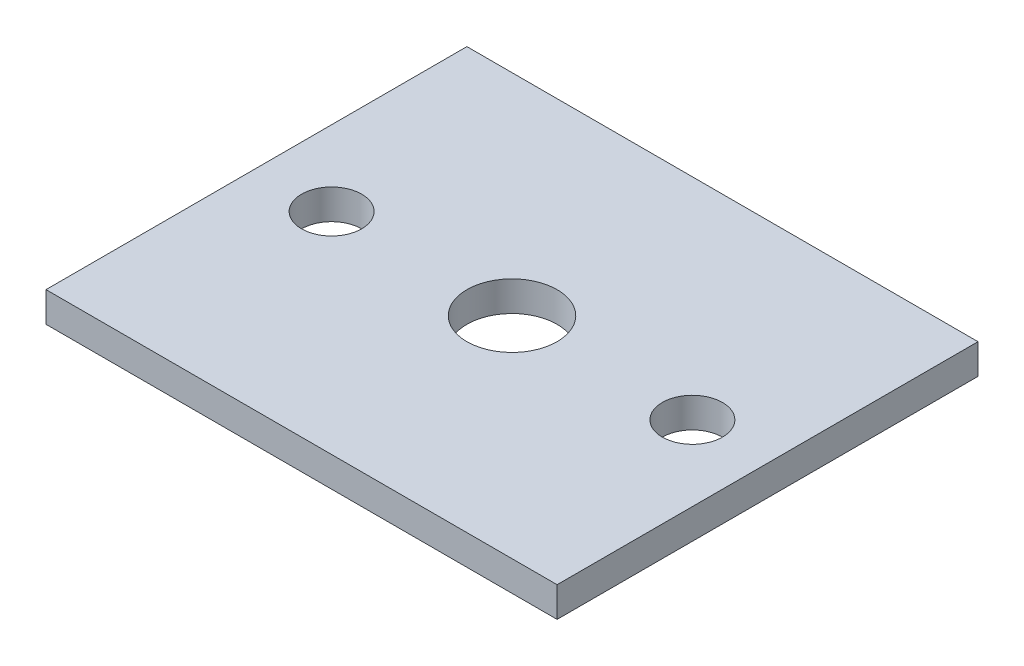
ISO-10303-21;
HEADER;
FILE_DESCRIPTION(('STEP AP214'),'2;1');
FILE_NAME('part.step','',(''),(''),'','','');
FILE_SCHEMA(('AUTOMOTIVE_DESIGN { 1 0 10303 214 1 1 1 1 }'));
ENDSEC;
DATA;
#1=APPLICATION_CONTEXT('core data for automotive mechanical design processes');
#2=APPLICATION_PROTOCOL_DEFINITION('international standard','automotive_design',2000,#1);
#3=PRODUCT_CONTEXT('',#1,'mechanical');
#4=PRODUCT('Part','Part','',(#3));
#5=PRODUCT_RELATED_PRODUCT_CATEGORY('part','',(#4));
#6=PRODUCT_DEFINITION_FORMATION('','',#4);
#7=PRODUCT_DEFINITION_CONTEXT('part definition',#1,'design');
#8=PRODUCT_DEFINITION('design','',#6,#7);
#9=PRODUCT_DEFINITION_SHAPE('','',#8);
#10=(LENGTH_UNIT() NAMED_UNIT(*) SI_UNIT(.MILLI.,.METRE.));
#11=(NAMED_UNIT(*) PLANE_ANGLE_UNIT() SI_UNIT($,.RADIAN.));
#12=(NAMED_UNIT(*) SI_UNIT($,.STERADIAN.) SOLID_ANGLE_UNIT());
#13=UNCERTAINTY_MEASURE_WITH_UNIT(LENGTH_MEASURE(1.E-05),#10,'distance_accuracy_value','');
#14=(GEOMETRIC_REPRESENTATION_CONTEXT(3) GLOBAL_UNCERTAINTY_ASSIGNED_CONTEXT((#13)) GLOBAL_UNIT_ASSIGNED_CONTEXT((#10,
#11,#12)) REPRESENTATION_CONTEXT('',''));
#15=CARTESIAN_POINT('',(0.,0.,0.));
#16=DIRECTION('',(0.,0.,1.));
#17=DIRECTION('',(1.,0.,0.));
#18=AXIS2_PLACEMENT_3D('',#15,#16,#17);
#19=CARTESIAN_POINT('',(0.,10.,0.));
#20=DIRECTION('',(1.,0.,0.));
#21=DIRECTION('',(0.,0.,-1.));
#22=AXIS2_PLACEMENT_3D('',#19,#20,#21);
#23=PLANE('',#22);
#24=DIRECTION('',(0.,0.,1.));
#25=VECTOR('',#24,1.);
#26=CARTESIAN_POINT('',(0.,0.,0.));
#27=LINE('',#26,#25);
#28=CARTESIAN_POINT('',(0.,0.,-140.));
#29=VERTEX_POINT('',#28);
#30=CARTESIAN_POINT('',(0.,0.,0.));
#31=VERTEX_POINT('',#30);
#32=EDGE_CURVE('E110',#29,#31,#27,.T.);
#33=ORIENTED_EDGE('',*,*,#32,.T.);
#34=DIRECTION('',(0.,-1.,0.));
#35=VECTOR('',#34,1.);
#36=CARTESIAN_POINT('',(0.,10.,0.));
#37=LINE('',#36,#35);
#38=CARTESIAN_POINT('',(0.,10.,0.));
#39=VERTEX_POINT('',#38);
#40=EDGE_CURVE('E11',#39,#31,#37,.T.);
#41=ORIENTED_EDGE('',*,*,#40,.F.);
#42=DIRECTION('',(0.,0.,1.));
#43=VECTOR('',#42,1.);
#44=CARTESIAN_POINT('',(0.,10.,0.));
#45=LINE('',#44,#43);
#46=CARTESIAN_POINT('',(0.,10.,-140.));
#47=VERTEX_POINT('',#46);
#48=EDGE_CURVE('E94',#47,#39,#45,.T.);
#49=ORIENTED_EDGE('',*,*,#48,.F.);
#50=DIRECTION('',(0.,-1.,0.));
#51=VECTOR('',#50,1.);
#52=CARTESIAN_POINT('',(0.,10.,-140.));
#53=LINE('',#52,#51);
#54=EDGE_CURVE('E106',#47,#29,#53,.T.);
#55=ORIENTED_EDGE('',*,*,#54,.T.);
#56=EDGE_LOOP('',(#33,#41,#49,#55));
#57=FACE_BOUND('',#56,.T.);
#58=ADVANCED_FACE('F42',(#57),#23,.F.);
#59=CARTESIAN_POINT('',(0.,10.,0.));
#60=DIRECTION('',(0.,0.,-1.));
#61=DIRECTION('',(-1.,0.,0.));
#62=AXIS2_PLACEMENT_3D('',#59,#60,#61);
#63=PLANE('',#62);
#64=DIRECTION('',(1.,0.,0.));
#65=VECTOR('',#64,1.);
#66=CARTESIAN_POINT('',(0.,0.,0.));
#67=LINE('',#66,#65);
#68=CARTESIAN_POINT('',(170.,0.,0.));
#69=VERTEX_POINT('',#68);
#70=EDGE_CURVE('E99',#31,#69,#67,.T.);
#71=ORIENTED_EDGE('',*,*,#70,.T.);
#72=DIRECTION('',(0.,-1.,0.));
#73=VECTOR('',#72,1.);
#74=CARTESIAN_POINT('',(170.,10.,0.));
#75=LINE('',#74,#73);
#76=CARTESIAN_POINT('',(170.,10.,0.));
#77=VERTEX_POINT('',#76);
#78=EDGE_CURVE('E51',#77,#69,#75,.T.);
#79=ORIENTED_EDGE('',*,*,#78,.F.);
#80=DIRECTION('',(1.,0.,0.));
#81=VECTOR('',#80,1.);
#82=CARTESIAN_POINT('',(0.,10.,0.));
#83=LINE('',#82,#81);
#84=EDGE_CURVE('E89',#39,#77,#83,.T.);
#85=ORIENTED_EDGE('',*,*,#84,.F.);
#86=ORIENTED_EDGE('',*,*,#40,.T.);
#87=EDGE_LOOP('',(#71,#79,#85,#86));
#88=FACE_BOUND('',#87,.T.);
#89=ADVANCED_FACE('F98',(#88),#63,.F.);
#90=CARTESIAN_POINT('',(170.,10.,0.));
#91=DIRECTION('',(-1.,0.,0.));
#92=DIRECTION('',(0.,0.,1.));
#93=AXIS2_PLACEMENT_3D('',#90,#91,#92);
#94=PLANE('',#93);
#95=DIRECTION('',(0.,0.,-1.));
#96=VECTOR('',#95,1.);
#97=CARTESIAN_POINT('',(170.,0.,0.));
#98=LINE('',#97,#96);
#99=CARTESIAN_POINT('',(170.,0.,-140.));
#100=VERTEX_POINT('',#99);
#101=EDGE_CURVE('E76',#69,#100,#98,.T.);
#102=ORIENTED_EDGE('',*,*,#101,.T.);
#103=DIRECTION('',(0.,-1.,0.));
#104=VECTOR('',#103,1.);
#105=CARTESIAN_POINT('',(170.,10.,-140.));
#106=LINE('',#105,#104);
#107=CARTESIAN_POINT('',(170.,10.,-140.));
#108=VERTEX_POINT('',#107);
#109=EDGE_CURVE('E101',#108,#100,#106,.T.);
#110=ORIENTED_EDGE('',*,*,#109,.F.);
#111=DIRECTION('',(0.,0.,-1.));
#112=VECTOR('',#111,1.);
#113=CARTESIAN_POINT('',(170.,10.,0.));
#114=LINE('',#113,#112);
#115=EDGE_CURVE('E92',#77,#108,#114,.T.);
#116=ORIENTED_EDGE('',*,*,#115,.F.);
#117=ORIENTED_EDGE('',*,*,#78,.T.);
#118=EDGE_LOOP('',(#102,#110,#116,#117));
#119=FACE_BOUND('',#118,.T.);
#120=ADVANCED_FACE('F102',(#119),#94,.F.);
#121=CARTESIAN_POINT('',(0.,10.,-140.));
#122=DIRECTION('',(0.,0.,1.));
#123=DIRECTION('',(1.,0.,0.));
#124=AXIS2_PLACEMENT_3D('',#121,#122,#123);
#125=PLANE('',#124);
#126=DIRECTION('',(-1.,0.,0.));
#127=VECTOR('',#126,1.);
#128=CARTESIAN_POINT('',(0.,0.,-140.));
#129=LINE('',#128,#127);
#130=EDGE_CURVE('E82',#100,#29,#129,.T.);
#131=ORIENTED_EDGE('',*,*,#130,.T.);
#132=ORIENTED_EDGE('',*,*,#54,.F.);
#133=DIRECTION('',(-1.,0.,0.));
#134=VECTOR('',#133,1.);
#135=CARTESIAN_POINT('',(0.,10.,-140.));
#136=LINE('',#135,#134);
#137=EDGE_CURVE('E59',#108,#47,#136,.T.);
#138=ORIENTED_EDGE('',*,*,#137,.F.);
#139=ORIENTED_EDGE('',*,*,#109,.T.);
#140=EDGE_LOOP('',(#131,#132,#138,#139));
#141=FACE_BOUND('',#140,.T.);
#142=ADVANCED_FACE('F124',(#141),#125,.F.);
#143=CARTESIAN_POINT('',(0.,10.,0.));
#144=DIRECTION('',(0.,-1.,0.));
#145=DIRECTION('',(0.,0.,-1.));
#146=AXIS2_PLACEMENT_3D('',#143,#144,#145);
#147=PLANE('',#146);
#148=CARTESIAN_POINT('',(25.,10.,-70.));
#149=DIRECTION('',(0.,1.,0.));
#150=DIRECTION('',(0.,0.,1.));
#151=AXIS2_PLACEMENT_3D('',#148,#149,#150);
#152=CIRCLE('',#151,10.);
#153=CARTESIAN_POINT('',(25.,10.,-60.));
#154=VERTEX_POINT('',#153);
#155=EDGE_CURVE('E147',#154,#154,#152,.T.);
#156=ORIENTED_EDGE('',*,*,#155,.F.);
#157=EDGE_LOOP('',(#156));
#158=FACE_BOUND('',#157,.T.);
#159=CARTESIAN_POINT('',(145.,10.,-70.));
#160=DIRECTION('',(0.,1.,0.));
#161=DIRECTION('',(0.,0.,1.));
#162=AXIS2_PLACEMENT_3D('',#159,#160,#161);
#163=CIRCLE('',#162,10.);
#164=CARTESIAN_POINT('',(145.,10.,-60.));
#165=VERTEX_POINT('',#164);
#166=EDGE_CURVE('E143',#165,#165,#163,.T.);
#167=ORIENTED_EDGE('',*,*,#166,.F.);
#168=EDGE_LOOP('',(#167));
#169=FACE_BOUND('',#168,.T.);
#170=CARTESIAN_POINT('',(85.,10.,-70.));
#171=DIRECTION('',(0.,1.,0.));
#172=DIRECTION('',(0.,0.,1.));
#173=AXIS2_PLACEMENT_3D('',#170,#171,#172);
#174=CIRCLE('',#173,15.);
#175=CARTESIAN_POINT('',(85.,10.,-55.));
#176=VERTEX_POINT('',#175);
#177=EDGE_CURVE('E135',#176,#176,#174,.T.);
#178=ORIENTED_EDGE('',*,*,#177,.F.);
#179=EDGE_LOOP('',(#178));
#180=FACE_BOUND('',#179,.T.);
#181=ORIENTED_EDGE('',*,*,#48,.T.);
#182=ORIENTED_EDGE('',*,*,#84,.T.);
#183=ORIENTED_EDGE('',*,*,#115,.T.);
#184=ORIENTED_EDGE('',*,*,#137,.T.);
#185=EDGE_LOOP('',(#181,#182,#183,#184));
#186=FACE_BOUND('',#185,.T.);
#187=ADVANCED_FACE('F90',(#158,#169,#180,#186),#147,.F.);
#188=CARTESIAN_POINT('',(0.,0.,0.));
#189=DIRECTION('',(0.,-1.,0.));
#190=DIRECTION('',(0.,0.,-1.));
#191=AXIS2_PLACEMENT_3D('',#188,#189,#190);
#192=PLANE('',#191);
#193=CARTESIAN_POINT('',(25.,0.,-70.));
#194=DIRECTION('',(0.,1.,0.));
#195=DIRECTION('',(0.,0.,1.));
#196=AXIS2_PLACEMENT_3D('',#193,#194,#195);
#197=CIRCLE('',#196,10.);
#198=CARTESIAN_POINT('',(25.,0.,-60.));
#199=VERTEX_POINT('',#198);
#200=EDGE_CURVE('E114',#199,#199,#197,.T.);
#201=ORIENTED_EDGE('',*,*,#200,.T.);
#202=EDGE_LOOP('',(#201));
#203=FACE_BOUND('',#202,.T.);
#204=CARTESIAN_POINT('',(145.,0.,-70.));
#205=DIRECTION('',(0.,1.,0.));
#206=DIRECTION('',(0.,0.,1.));
#207=AXIS2_PLACEMENT_3D('',#204,#205,#206);
#208=CIRCLE('',#207,10.);
#209=CARTESIAN_POINT('',(145.,0.,-60.));
#210=VERTEX_POINT('',#209);
#211=EDGE_CURVE('E139',#210,#210,#208,.T.);
#212=ORIENTED_EDGE('',*,*,#211,.T.);
#213=EDGE_LOOP('',(#212));
#214=FACE_BOUND('',#213,.T.);
#215=CARTESIAN_POINT('',(85.,0.,-70.));
#216=DIRECTION('',(0.,1.,0.));
#217=DIRECTION('',(0.,0.,1.));
#218=AXIS2_PLACEMENT_3D('',#215,#216,#217);
#219=CIRCLE('',#218,15.);
#220=CARTESIAN_POINT('',(85.,0.,-55.));
#221=VERTEX_POINT('',#220);
#222=EDGE_CURVE('E131',#221,#221,#219,.T.);
#223=ORIENTED_EDGE('',*,*,#222,.T.);
#224=EDGE_LOOP('',(#223));
#225=FACE_BOUND('',#224,.T.);
#226=ORIENTED_EDGE('',*,*,#32,.F.);
#227=ORIENTED_EDGE('',*,*,#130,.F.);
#228=ORIENTED_EDGE('',*,*,#101,.F.);
#229=ORIENTED_EDGE('',*,*,#70,.F.);
#230=EDGE_LOOP('',(#226,#227,#228,#229));
#231=FACE_BOUND('',#230,.T.);
#232=ADVANCED_FACE('F127',(#203,#214,#225,#231),#192,.T.);
#233=CARTESIAN_POINT('',(85.,0.,-70.));
#234=DIRECTION('',(0.,1.,0.));
#235=DIRECTION('',(0.,0.,1.));
#236=AXIS2_PLACEMENT_3D('',#233,#234,#235);
#237=CYLINDRICAL_SURFACE('',#236,15.);
#238=ORIENTED_EDGE('',*,*,#222,.F.);
#239=EDGE_LOOP('',(#238));
#240=FACE_BOUND('',#239,.T.);
#241=ORIENTED_EDGE('',*,*,#177,.T.);
#242=EDGE_LOOP('',(#241));
#243=FACE_BOUND('',#242,.T.);
#244=ADVANCED_FACE('F171',(#240,#243),#237,.F.);
#245=CARTESIAN_POINT('',(145.,0.,-70.));
#246=DIRECTION('',(0.,1.,0.));
#247=DIRECTION('',(0.,0.,1.));
#248=AXIS2_PLACEMENT_3D('',#245,#246,#247);
#249=CYLINDRICAL_SURFACE('',#248,10.);
#250=ORIENTED_EDGE('',*,*,#211,.F.);
#251=EDGE_LOOP('',(#250));
#252=FACE_BOUND('',#251,.T.);
#253=ORIENTED_EDGE('',*,*,#166,.T.);
#254=EDGE_LOOP('',(#253));
#255=FACE_BOUND('',#254,.T.);
#256=ADVANCED_FACE('F160',(#252,#255),#249,.F.);
#257=CARTESIAN_POINT('',(25.,0.,-70.));
#258=DIRECTION('',(0.,1.,0.));
#259=DIRECTION('',(0.,0.,1.));
#260=AXIS2_PLACEMENT_3D('',#257,#258,#259);
#261=CYLINDRICAL_SURFACE('',#260,10.);
#262=ORIENTED_EDGE('',*,*,#200,.F.);
#263=EDGE_LOOP('',(#262));
#264=FACE_BOUND('',#263,.T.);
#265=ORIENTED_EDGE('',*,*,#155,.T.);
#266=EDGE_LOOP('',(#265));
#267=FACE_BOUND('',#266,.T.);
#268=ADVANCED_FACE('F157',(#264,#267),#261,.F.);
#269=CLOSED_SHELL('',(#58,#89,#120,#142,#187,#232,#244,#256,#268));
#270=MANIFOLD_SOLID_BREP('B2',#269);
#271=ADVANCED_BREP_SHAPE_REPRESENTATION('',(#18,#270),#14);
#272=SHAPE_DEFINITION_REPRESENTATION(#9,#271);
ENDSEC;
END-ISO-10303-21;
